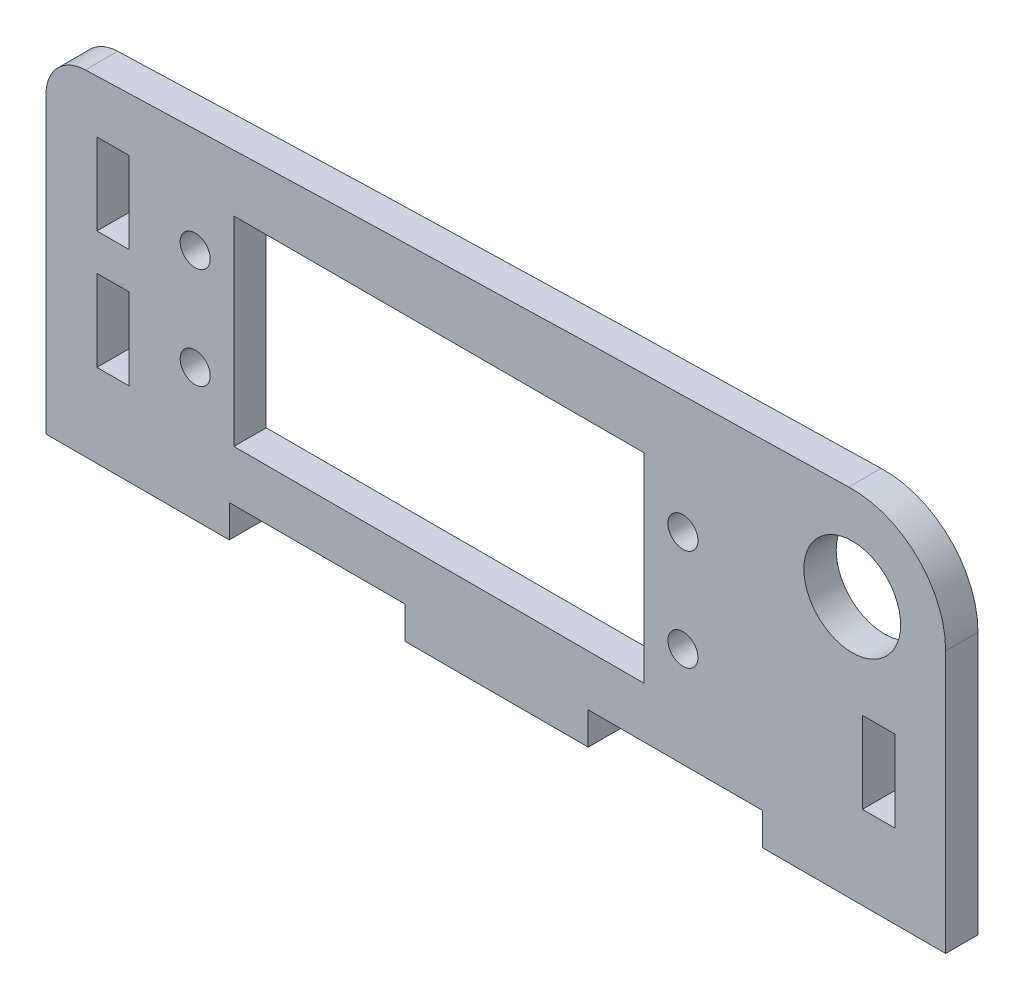
ISO-10303-21;
HEADER;
FILE_DESCRIPTION(('STEP AP214'),'2;1');
FILE_NAME('part.step','',(''),(''),'','','');
FILE_SCHEMA(('AUTOMOTIVE_DESIGN { 1 0 10303 214 1 1 1 1 }'));
ENDSEC;
DATA;
#1=APPLICATION_CONTEXT('core data for automotive mechanical design processes');
#2=APPLICATION_PROTOCOL_DEFINITION('international standard','automotive_design',2000,#1);
#3=PRODUCT_CONTEXT('',#1,'mechanical');
#4=PRODUCT('Part','Part','',(#3));
#5=PRODUCT_RELATED_PRODUCT_CATEGORY('part','',(#4));
#6=PRODUCT_DEFINITION_FORMATION('','',#4);
#7=PRODUCT_DEFINITION_CONTEXT('part definition',#1,'design');
#8=PRODUCT_DEFINITION('design','',#6,#7);
#9=PRODUCT_DEFINITION_SHAPE('','',#8);
#10=(LENGTH_UNIT() NAMED_UNIT(*) SI_UNIT(.MILLI.,.METRE.));
#11=(NAMED_UNIT(*) PLANE_ANGLE_UNIT() SI_UNIT($,.RADIAN.));
#12=(NAMED_UNIT(*) SI_UNIT($,.STERADIAN.) SOLID_ANGLE_UNIT());
#13=UNCERTAINTY_MEASURE_WITH_UNIT(LENGTH_MEASURE(1.E-05),#10,'distance_accuracy_value','');
#14=(GEOMETRIC_REPRESENTATION_CONTEXT(3) GLOBAL_UNCERTAINTY_ASSIGNED_CONTEXT((#13)) GLOBAL_UNIT_ASSIGNED_CONTEXT((#10,
#11,#12)) REPRESENTATION_CONTEXT('',''));
#15=CARTESIAN_POINT('',(0.,0.,0.));
#16=DIRECTION('',(0.,0.,1.));
#17=DIRECTION('',(1.,0.,0.));
#18=AXIS2_PLACEMENT_3D('',#15,#16,#17);
#19=CARTESIAN_POINT('',(26.416,-14.8,3.175));
#20=DIRECTION('',(0.,-1.,0.));
#21=DIRECTION('',(1.,0.,0.));
#22=AXIS2_PLACEMENT_3D('',#19,#20,#21);
#23=PLANE('',#22);
#24=DIRECTION('',(0.,0.,-1.));
#25=VECTOR('',#24,1.);
#26=CARTESIAN_POINT('',(-20.6,-14.8,21.4528725512572));
#27=LINE('',#26,#25);
#28=CARTESIAN_POINT('',(-20.6,-14.8,3.175));
#29=VERTEX_POINT('',#28);
#30=CARTESIAN_POINT('',(-20.6,-14.8,0.));
#31=VERTEX_POINT('',#30);
#32=EDGE_CURVE('E53',#29,#31,#27,.T.);
#33=ORIENTED_EDGE('',*,*,#32,.T.);
#34=DIRECTION('',(-1.,0.,0.));
#35=VECTOR('',#34,1.);
#36=CARTESIAN_POINT('',(26.416,-14.8,0.));
#37=LINE('',#36,#35);
#38=CARTESIAN_POINT('',(-3.35000000000001,-14.8,0.));
#39=VERTEX_POINT('',#38);
#40=EDGE_CURVE('E476',#39,#31,#37,.T.);
#41=ORIENTED_EDGE('',*,*,#40,.F.);
#42=DIRECTION('',(0.,0.,-1.));
#43=VECTOR('',#42,1.);
#44=CARTESIAN_POINT('',(-3.35000000000001,-14.8,21.4528725512572));
#45=LINE('',#44,#43);
#46=CARTESIAN_POINT('',(-3.35000000000001,-14.8,3.175));
#47=VERTEX_POINT('',#46);
#48=EDGE_CURVE('E279',#47,#39,#45,.T.);
#49=ORIENTED_EDGE('',*,*,#48,.F.);
#50=DIRECTION('',(-1.,0.,0.));
#51=VECTOR('',#50,1.);
#52=CARTESIAN_POINT('',(26.416,-14.8,3.175));
#53=LINE('',#52,#51);
#54=EDGE_CURVE('E58',#47,#29,#53,.T.);
#55=ORIENTED_EDGE('',*,*,#54,.T.);
#56=EDGE_LOOP('',(#33,#41,#49,#55));
#57=FACE_BOUND('',#56,.T.);
#58=ADVANCED_FACE('F38',(#57),#23,.T.);
#59=CARTESIAN_POINT('',(40.576,7.77,15.1599874843489));
#60=DIRECTION('',(0.,0.,-1.));
#61=DIRECTION('',(-1.,0.,0.));
#62=AXIS2_PLACEMENT_3D('',#59,#60,#61);
#63=CYLINDRICAL_SURFACE('',#62,9.17500000000001);
#64=CARTESIAN_POINT('',(40.576,7.77,0.));
#65=DIRECTION('',(0.,0.,-1.));
#66=DIRECTION('',(-1.,0.,0.));
#67=AXIS2_PLACEMENT_3D('',#64,#65,#66);
#68=CIRCLE('',#67,9.17500000000001);
#69=CARTESIAN_POINT('',(40.2242265775887,16.9382539482327,0.));
#70=VERTEX_POINT('',#69);
#71=CARTESIAN_POINT('',(49.751,7.77,0.));
#72=VERTEX_POINT('',#71);
#73=EDGE_CURVE('E409',#70,#72,#68,.T.);
#74=ORIENTED_EDGE('',*,*,#73,.F.);
#75=DIRECTION('',(0.,0.,-1.));
#76=VECTOR('',#75,1.);
#77=CARTESIAN_POINT('',(40.2242265775887,16.9382539482327,82.0282233044545));
#78=LINE('',#77,#76);
#79=CARTESIAN_POINT('',(40.2242265775887,16.9382539482327,3.175));
#80=VERTEX_POINT('',#79);
#81=EDGE_CURVE('E331',#80,#70,#78,.T.);
#82=ORIENTED_EDGE('',*,*,#81,.F.);
#83=CARTESIAN_POINT('',(40.576,7.77,3.175));
#84=DIRECTION('',(0.,0.,1.));
#85=DIRECTION('',(1.,0.,0.));
#86=AXIS2_PLACEMENT_3D('',#83,#84,#85);
#87=CIRCLE('',#86,9.17500000000001);
#88=CARTESIAN_POINT('',(49.751,7.77,3.175));
#89=VERTEX_POINT('',#88);
#90=EDGE_CURVE('E411',#80,#89,#87,.F.);
#91=ORIENTED_EDGE('',*,*,#90,.T.);
#92=DIRECTION('',(0.,0.,-1.));
#93=VECTOR('',#92,1.);
#94=CARTESIAN_POINT('',(49.751,7.77,10.));
#95=LINE('',#94,#93);
#96=EDGE_CURVE('E403',#89,#72,#95,.T.);
#97=ORIENTED_EDGE('',*,*,#96,.T.);
#98=EDGE_LOOP('',(#74,#82,#91,#97));
#99=FACE_BOUND('',#98,.T.);
#100=ADVANCED_FACE('F576',(#99),#63,.T.);
#101=CARTESIAN_POINT('',(-30.425,0.,33.0452541167631));
#102=DIRECTION('',(1.,0.,0.));
#103=DIRECTION('',(0.,1.,0.));
#104=AXIS2_PLACEMENT_3D('',#101,#102,#103);
#105=PLANE('',#104);
#106=DIRECTION('',(0.,0.,-1.));
#107=VECTOR('',#106,1.);
#108=CARTESIAN_POINT('',(-30.425,-9.79999999999999,33.8831524191867));
#109=LINE('',#108,#107);
#110=CARTESIAN_POINT('',(-30.425,-9.79999999999999,3.175));
#111=VERTEX_POINT('',#110);
#112=CARTESIAN_POINT('',(-30.425,-9.79999999999999,0.));
#113=VERTEX_POINT('',#112);
#114=EDGE_CURVE('E348',#111,#113,#109,.T.);
#115=ORIENTED_EDGE('',*,*,#114,.F.);
#116=DIRECTION('',(0.,-1.,0.));
#117=VECTOR('',#116,1.);
#118=CARTESIAN_POINT('',(-30.425,0.,3.175));
#119=LINE('',#118,#117);
#120=CARTESIAN_POINT('',(-30.425,-1.79999999999999,3.175));
#121=VERTEX_POINT('',#120);
#122=EDGE_CURVE('E397',#121,#111,#119,.T.);
#123=ORIENTED_EDGE('',*,*,#122,.F.);
#124=DIRECTION('',(0.,0.,-1.));
#125=VECTOR('',#124,1.);
#126=CARTESIAN_POINT('',(-30.425,-1.79999999999999,33.8831524191867));
#127=LINE('',#126,#125);
#128=CARTESIAN_POINT('',(-30.425,-1.79999999999999,0.));
#129=VERTEX_POINT('',#128);
#130=EDGE_CURVE('E386',#121,#129,#127,.T.);
#131=ORIENTED_EDGE('',*,*,#130,.T.);
#132=DIRECTION('',(0.,-1.,0.));
#133=VECTOR('',#132,1.);
#134=CARTESIAN_POINT('',(-30.425,0.,0.));
#135=LINE('',#134,#133);
#136=EDGE_CURVE('E375',#129,#113,#135,.T.);
#137=ORIENTED_EDGE('',*,*,#136,.T.);
#138=EDGE_LOOP('',(#115,#123,#131,#137));
#139=FACE_BOUND('',#138,.T.);
#140=ADVANCED_FACE('F597',(#139),#105,.F.);
#141=DIRECTION('',(0.,0.,-1.));
#142=VECTOR('',#141,1.);
#143=CARTESIAN_POINT('',(-30.425,1.8,33.8831524191867));
#144=LINE('',#143,#142);
#145=CARTESIAN_POINT('',(-30.425,1.8,3.175));
#146=VERTEX_POINT('',#145);
#147=CARTESIAN_POINT('',(-30.425,1.8,0.));
#148=VERTEX_POINT('',#147);
#149=EDGE_CURVE('E359',#146,#148,#144,.T.);
#150=ORIENTED_EDGE('',*,*,#149,.F.);
#151=CARTESIAN_POINT('',(-30.425,9.8,3.175));
#152=VERTEX_POINT('',#151);
#153=EDGE_CURVE('E400',#152,#146,#119,.T.);
#154=ORIENTED_EDGE('',*,*,#153,.F.);
#155=DIRECTION('',(0.,0.,-1.));
#156=VECTOR('',#155,1.);
#157=CARTESIAN_POINT('',(-30.425,9.8,33.8831524191867));
#158=LINE('',#157,#156);
#159=CARTESIAN_POINT('',(-30.425,9.8,0.));
#160=VERTEX_POINT('',#159);
#161=EDGE_CURVE('E365',#152,#160,#158,.T.);
#162=ORIENTED_EDGE('',*,*,#161,.T.);
#163=EDGE_CURVE('E396',#160,#148,#135,.T.);
#164=ORIENTED_EDGE('',*,*,#163,.T.);
#165=EDGE_LOOP('',(#150,#154,#162,#164));
#166=FACE_BOUND('',#165,.T.);
#167=ADVANCED_FACE('F516',(#166),#105,.F.);
#168=CARTESIAN_POINT('',(0.,0.,0.));
#169=DIRECTION('',(0.,0.,1.));
#170=DIRECTION('',(1.,0.,0.));
#171=AXIS2_PLACEMENT_3D('',#168,#169,#170);
#172=PLANE('',#171);
#173=DIRECTION('',(-1.,0.,0.));
#174=VECTOR('',#173,1.);
#175=CARTESIAN_POINT('',(44.751,-9.79999999999999,0.));
#176=LINE('',#175,#174);
#177=CARTESIAN_POINT('',(44.751,-9.79999999999999,0.));
#178=VERTEX_POINT('',#177);
#179=CARTESIAN_POINT('',(41.576,-9.79999999999999,0.));
#180=VERTEX_POINT('',#179);
#181=EDGE_CURVE('E319',#178,#180,#176,.T.);
#182=ORIENTED_EDGE('',*,*,#181,.F.);
#183=DIRECTION('',(0.,-1.,0.));
#184=VECTOR('',#183,1.);
#185=CARTESIAN_POINT('',(44.751,-9.79999999999999,0.));
#186=LINE('',#185,#184);
#187=CARTESIAN_POINT('',(44.751,-1.79999999999999,0.));
#188=VERTEX_POINT('',#187);
#189=EDGE_CURVE('E311',#188,#178,#186,.T.);
#190=ORIENTED_EDGE('',*,*,#189,.F.);
#191=DIRECTION('',(1.,0.,0.));
#192=VECTOR('',#191,1.);
#193=CARTESIAN_POINT('',(44.751,-1.79999999999999,0.));
#194=LINE('',#193,#192);
#195=CARTESIAN_POINT('',(41.576,-1.79999999999999,0.));
#196=VERTEX_POINT('',#195);
#197=EDGE_CURVE('E325',#196,#188,#194,.T.);
#198=ORIENTED_EDGE('',*,*,#197,.F.);
#199=DIRECTION('',(0.,1.,0.));
#200=VECTOR('',#199,1.);
#201=CARTESIAN_POINT('',(41.576,-9.79999999999999,0.));
#202=LINE('',#201,#200);
#203=EDGE_CURVE('E322',#180,#196,#202,.T.);
#204=ORIENTED_EDGE('',*,*,#203,.F.);
#205=EDGE_LOOP('',(#182,#190,#198,#204));
#206=FACE_BOUND('',#205,.T.);
#207=DIRECTION('',(-1.,0.,0.));
#208=VECTOR('',#207,1.);
#209=CARTESIAN_POINT('',(0.,-9.79999999999999,0.));
#210=LINE('',#209,#208);
#211=CARTESIAN_POINT('',(-33.6,-9.79999999999999,0.));
#212=VERTEX_POINT('',#211);
#213=EDGE_CURVE('E344',#113,#212,#210,.T.);
#214=ORIENTED_EDGE('',*,*,#213,.F.);
#215=ORIENTED_EDGE('',*,*,#136,.F.);
#216=DIRECTION('',(-1.,0.,0.));
#217=VECTOR('',#216,1.);
#218=CARTESIAN_POINT('',(0.,-1.79999999999999,0.));
#219=LINE('',#218,#217);
#220=CARTESIAN_POINT('',(-33.6,-1.79999999999999,0.));
#221=VERTEX_POINT('',#220);
#222=EDGE_CURVE('E351',#129,#221,#219,.T.);
#223=ORIENTED_EDGE('',*,*,#222,.T.);
#224=DIRECTION('',(0.,-1.,0.));
#225=VECTOR('',#224,1.);
#226=CARTESIAN_POINT('',(-33.6,0.,0.));
#227=LINE('',#226,#225);
#228=EDGE_CURVE('E246',#221,#212,#227,.T.);
#229=ORIENTED_EDGE('',*,*,#228,.T.);
#230=EDGE_LOOP('',(#214,#215,#223,#229));
#231=FACE_BOUND('',#230,.T.);
#232=DIRECTION('',(-1.,0.,0.));
#233=VECTOR('',#232,1.);
#234=CARTESIAN_POINT('',(0.,1.8,0.));
#235=LINE('',#234,#233);
#236=CARTESIAN_POINT('',(-33.6,1.8,0.));
#237=VERTEX_POINT('',#236);
#238=EDGE_CURVE('E355',#148,#237,#235,.T.);
#239=ORIENTED_EDGE('',*,*,#238,.F.);
#240=ORIENTED_EDGE('',*,*,#163,.F.);
#241=DIRECTION('',(-1.,0.,0.));
#242=VECTOR('',#241,1.);
#243=CARTESIAN_POINT('',(0.,9.8,0.));
#244=LINE('',#243,#242);
#245=CARTESIAN_POINT('',(-33.6,9.8,0.));
#246=VERTEX_POINT('',#245);
#247=EDGE_CURVE('E362',#160,#246,#244,.T.);
#248=ORIENTED_EDGE('',*,*,#247,.T.);
#249=DIRECTION('',(0.,-1.,0.));
#250=VECTOR('',#249,1.);
#251=CARTESIAN_POINT('',(-33.6,0.,0.));
#252=LINE('',#251,#250);
#253=EDGE_CURVE('E354',#246,#237,#252,.T.);
#254=ORIENTED_EDGE('',*,*,#253,.T.);
#255=EDGE_LOOP('',(#239,#240,#248,#254));
#256=FACE_BOUND('',#255,.T.);
#257=CARTESIAN_POINT('',(23.95,4.974,0.));
#258=DIRECTION('',(0.,0.,1.));
#259=DIRECTION('',(1.,0.,0.));
#260=AXIS2_PLACEMENT_3D('',#257,#258,#259);
#261=CIRCLE('',#260,1.475);
#262=CARTESIAN_POINT('',(25.425,4.974,0.));
#263=VERTEX_POINT('',#262);
#264=EDGE_CURVE('E455',#263,#263,#261,.T.);
#265=ORIENTED_EDGE('',*,*,#264,.T.);
#266=EDGE_LOOP('',(#265));
#267=FACE_BOUND('',#266,.T.);
#268=CARTESIAN_POINT('',(23.95,-4.974,0.));
#269=DIRECTION('',(0.,0.,1.));
#270=DIRECTION('',(1.,0.,0.));
#271=AXIS2_PLACEMENT_3D('',#268,#269,#270);
#272=CIRCLE('',#271,1.475);
#273=CARTESIAN_POINT('',(25.425,-4.974,0.));
#274=VERTEX_POINT('',#273);
#275=EDGE_CURVE('E452',#274,#274,#272,.T.);
#276=ORIENTED_EDGE('',*,*,#275,.T.);
#277=EDGE_LOOP('',(#276));
#278=FACE_BOUND('',#277,.T.);
#279=DIRECTION('',(0.,1.,0.));
#280=VECTOR('',#279,1.);
#281=CARTESIAN_POINT('',(-20.15,0.,0.));
#282=LINE('',#281,#280);
#283=CARTESIAN_POINT('',(-20.15,-9.8,0.));
#284=VERTEX_POINT('',#283);
#285=CARTESIAN_POINT('',(-20.15,9.8,0.));
#286=VERTEX_POINT('',#285);
#287=EDGE_CURVE('E421',#284,#286,#282,.T.);
#288=ORIENTED_EDGE('',*,*,#287,.F.);
#289=DIRECTION('',(-1.,0.,0.));
#290=VECTOR('',#289,1.);
#291=CARTESIAN_POINT('',(26.416,-9.8,0.));
#292=LINE('',#291,#290);
#293=CARTESIAN_POINT('',(20.15,-9.8,0.));
#294=VERTEX_POINT('',#293);
#295=EDGE_CURVE('E475',#294,#284,#292,.T.);
#296=ORIENTED_EDGE('',*,*,#295,.F.);
#297=DIRECTION('',(0.,1.,0.));
#298=VECTOR('',#297,1.);
#299=CARTESIAN_POINT('',(20.15,0.,0.));
#300=LINE('',#299,#298);
#301=CARTESIAN_POINT('',(20.15,9.8,0.));
#302=VERTEX_POINT('',#301);
#303=EDGE_CURVE('E445',#294,#302,#300,.T.);
#304=ORIENTED_EDGE('',*,*,#303,.T.);
#305=DIRECTION('',(1.,0.,0.));
#306=VECTOR('',#305,1.);
#307=CARTESIAN_POINT('',(-26.416,9.8,0.));
#308=LINE('',#307,#306);
#309=EDGE_CURVE('E465',#286,#302,#308,.T.);
#310=ORIENTED_EDGE('',*,*,#309,.F.);
#311=EDGE_LOOP('',(#288,#296,#304,#310));
#312=FACE_BOUND('',#311,.T.);
#313=CARTESIAN_POINT('',(-23.95,-4.974,0.));
#314=DIRECTION('',(0.,0.,1.));
#315=DIRECTION('',(1.,0.,0.));
#316=AXIS2_PLACEMENT_3D('',#313,#314,#315);
#317=CIRCLE('',#316,1.475);
#318=CARTESIAN_POINT('',(-22.475,-4.974,0.));
#319=VERTEX_POINT('',#318);
#320=EDGE_CURVE('E431',#319,#319,#317,.T.);
#321=ORIENTED_EDGE('',*,*,#320,.T.);
#322=EDGE_LOOP('',(#321));
#323=FACE_BOUND('',#322,.T.);
#324=CARTESIAN_POINT('',(-23.95,4.974,0.));
#325=DIRECTION('',(0.,0.,1.));
#326=DIRECTION('',(1.,0.,0.));
#327=AXIS2_PLACEMENT_3D('',#324,#325,#326);
#328=CIRCLE('',#327,1.475);
#329=CARTESIAN_POINT('',(-22.475,4.974,0.));
#330=VERTEX_POINT('',#329);
#331=EDGE_CURVE('E428',#330,#330,#328,.T.);
#332=ORIENTED_EDGE('',*,*,#331,.T.);
#333=EDGE_LOOP('',(#332));
#334=FACE_BOUND('',#333,.T.);
#335=CARTESIAN_POINT('',(40.576,7.77,0.));
#336=DIRECTION('',(0.,0.,-1.));
#337=DIRECTION('',(-1.,0.,0.));
#338=AXIS2_PLACEMENT_3D('',#335,#336,#337);
#339=CIRCLE('',#338,4.75);
#340=CARTESIAN_POINT('',(35.826,7.77,0.));
#341=VERTEX_POINT('',#340);
#342=EDGE_CURVE('E413',#341,#341,#339,.T.);
#343=ORIENTED_EDGE('',*,*,#342,.F.);
#344=EDGE_LOOP('',(#343));
#345=FACE_BOUND('',#344,.T.);
#346=DIRECTION('',(0.,-1.,0.));
#347=VECTOR('',#346,1.);
#348=CARTESIAN_POINT('',(-38.6,0.,0.));
#349=LINE('',#348,#347);
#350=CARTESIAN_POINT('',(-38.6,10.9362242655928,0.));
#351=VERTEX_POINT('',#350);
#352=CARTESIAN_POINT('',(-38.6,-17.975,0.));
#353=VERTEX_POINT('',#352);
#354=EDGE_CURVE('E252',#351,#353,#349,.T.);
#355=ORIENTED_EDGE('',*,*,#354,.F.);
#356=CARTESIAN_POINT('',(-34.6,10.9362242655928,0.));
#357=DIRECTION('',(0.,0.,1.));
#358=DIRECTION('',(1.,0.,0.));
#359=AXIS2_PLACEMENT_3D('',#356,#357,#358);
#360=CIRCLE('',#359,4.);
#361=CARTESIAN_POINT('',(-34.7369921599961,14.9338777208214,0.));
#362=VERTEX_POINT('',#361);
#363=EDGE_CURVE('E482',#351,#362,#360,.F.);
#364=ORIENTED_EDGE('',*,*,#363,.T.);
#365=CARTESIAN_POINT('',(135.970658529118,-4966.59228867196,0.));
#366=DIRECTION('',(0.,0.,-1.));
#367=DIRECTION('',(-1.,0.,0.));
#368=AXIS2_PLACEMENT_3D('',#365,#366,#367);
#369=CIRCLE('',#368,4984.45022529665);
#370=EDGE_CURVE('E338',#70,#362,#369,.F.);
#371=ORIENTED_EDGE('',*,*,#370,.F.);
#372=ORIENTED_EDGE('',*,*,#73,.T.);
#373=DIRECTION('',(0.,-1.,0.));
#374=VECTOR('',#373,1.);
#375=CARTESIAN_POINT('',(49.751,0.,0.));
#376=LINE('',#375,#374);
#377=CARTESIAN_POINT('',(49.751,-17.975,0.));
#378=VERTEX_POINT('',#377);
#379=EDGE_CURVE('E401',#72,#378,#376,.T.);
#380=ORIENTED_EDGE('',*,*,#379,.T.);
#381=DIRECTION('',(-1.,0.,0.));
#382=VECTOR('',#381,1.);
#383=CARTESIAN_POINT('',(49.751,-17.975,0.));
#384=LINE('',#383,#382);
#385=CARTESIAN_POINT('',(31.751,-17.975,0.));
#386=VERTEX_POINT('',#385);
#387=EDGE_CURVE('E301',#378,#386,#384,.T.);
#388=ORIENTED_EDGE('',*,*,#387,.T.);
#389=DIRECTION('',(0.,-1.,0.));
#390=VECTOR('',#389,1.);
#391=CARTESIAN_POINT('',(31.751,-14.8,0.));
#392=LINE('',#391,#390);
#393=CARTESIAN_POINT('',(31.751,-14.8,0.));
#394=VERTEX_POINT('',#393);
#395=EDGE_CURVE('E298',#394,#386,#392,.T.);
#396=ORIENTED_EDGE('',*,*,#395,.F.);
#397=CARTESIAN_POINT('',(14.65,-14.8,0.));
#398=VERTEX_POINT('',#397);
#399=EDGE_CURVE('E472',#394,#398,#37,.T.);
#400=ORIENTED_EDGE('',*,*,#399,.T.);
#401=DIRECTION('',(0.,-1.,0.));
#402=VECTOR('',#401,1.);
#403=CARTESIAN_POINT('',(14.65,-14.8,0.));
#404=LINE('',#403,#402);
#405=CARTESIAN_POINT('',(14.65,-17.975,0.));
#406=VERTEX_POINT('',#405);
#407=EDGE_CURVE('E264',#398,#406,#404,.T.);
#408=ORIENTED_EDGE('',*,*,#407,.T.);
#409=DIRECTION('',(-1.,0.,0.));
#410=VECTOR('',#409,1.);
#411=CARTESIAN_POINT('',(14.65,-17.975,0.));
#412=LINE('',#411,#410);
#413=CARTESIAN_POINT('',(-3.35000000000001,-17.975,0.));
#414=VERTEX_POINT('',#413);
#415=EDGE_CURVE('E291',#406,#414,#412,.T.);
#416=ORIENTED_EDGE('',*,*,#415,.T.);
#417=DIRECTION('',(0.,-1.,0.));
#418=VECTOR('',#417,1.);
#419=CARTESIAN_POINT('',(-3.35000000000001,-14.8,0.));
#420=LINE('',#419,#418);
#421=EDGE_CURVE('E283',#39,#414,#420,.T.);
#422=ORIENTED_EDGE('',*,*,#421,.F.);
#423=ORIENTED_EDGE('',*,*,#40,.T.);
#424=DIRECTION('',(0.,-1.,0.));
#425=VECTOR('',#424,1.);
#426=CARTESIAN_POINT('',(-20.6,-14.8,0.));
#427=LINE('',#426,#425);
#428=CARTESIAN_POINT('',(-20.6,-17.975,0.));
#429=VERTEX_POINT('',#428);
#430=EDGE_CURVE('E272',#31,#429,#427,.T.);
#431=ORIENTED_EDGE('',*,*,#430,.T.);
#432=DIRECTION('',(-1.,0.,0.));
#433=VECTOR('',#432,1.);
#434=CARTESIAN_POINT('',(-20.6,-17.975,0.));
#435=LINE('',#434,#433);
#436=EDGE_CURVE('E270',#429,#353,#435,.T.);
#437=ORIENTED_EDGE('',*,*,#436,.T.);
#438=EDGE_LOOP('',(#355,#364,#371,#372,#380,#388,#396,#400,#408,#416,#422,#423,#431,#437));
#439=FACE_BOUND('',#438,.T.);
#440=ADVANCED_FACE('F513',(#206,#231,#256,#267,#278,#312,#323,#334,#345,#439),#172,.F.);
#441=CARTESIAN_POINT('',(0.,0.,3.175));
#442=DIRECTION('',(0.,0.,1.));
#443=DIRECTION('',(1.,0.,0.));
#444=AXIS2_PLACEMENT_3D('',#441,#442,#443);
#445=PLANE('',#444);
#446=DIRECTION('',(0.,1.,0.));
#447=VECTOR('',#446,1.);
#448=CARTESIAN_POINT('',(44.751,0.,3.175));
#449=LINE('',#448,#447);
#450=CARTESIAN_POINT('',(44.751,-9.79999999999999,3.175));
#451=VERTEX_POINT('',#450);
#452=CARTESIAN_POINT('',(44.751,-1.79999999999999,3.175));
#453=VERTEX_POINT('',#452);
#454=EDGE_CURVE('E11',#451,#453,#449,.T.);
#455=ORIENTED_EDGE('',*,*,#454,.F.);
#456=DIRECTION('',(1.,0.,0.));
#457=VECTOR('',#456,1.);
#458=CARTESIAN_POINT('',(0.,-9.79999999999999,3.175));
#459=LINE('',#458,#457);
#460=CARTESIAN_POINT('',(41.576,-9.79999999999999,3.175));
#461=VERTEX_POINT('',#460);
#462=EDGE_CURVE('E487',#461,#451,#459,.T.);
#463=ORIENTED_EDGE('',*,*,#462,.F.);
#464=DIRECTION('',(0.,-1.,0.));
#465=VECTOR('',#464,1.);
#466=CARTESIAN_POINT('',(41.576,0.,3.175));
#467=LINE('',#466,#465);
#468=CARTESIAN_POINT('',(41.576,-1.79999999999999,3.175));
#469=VERTEX_POINT('',#468);
#470=EDGE_CURVE('E489',#469,#461,#467,.T.);
#471=ORIENTED_EDGE('',*,*,#470,.F.);
#472=DIRECTION('',(-1.,0.,0.));
#473=VECTOR('',#472,1.);
#474=CARTESIAN_POINT('',(0.,-1.79999999999999,3.175));
#475=LINE('',#474,#473);
#476=EDGE_CURVE('E46',#453,#469,#475,.T.);
#477=ORIENTED_EDGE('',*,*,#476,.F.);
#478=EDGE_LOOP('',(#455,#463,#471,#477));
#479=FACE_BOUND('',#478,.T.);
#480=DIRECTION('',(-1.,0.,0.));
#481=VECTOR('',#480,1.);
#482=CARTESIAN_POINT('',(0.,9.8,3.175));
#483=LINE('',#482,#481);
#484=CARTESIAN_POINT('',(-33.6,9.8,3.175));
#485=VERTEX_POINT('',#484);
#486=EDGE_CURVE('E367',#152,#485,#483,.T.);
#487=ORIENTED_EDGE('',*,*,#486,.F.);
#488=ORIENTED_EDGE('',*,*,#153,.T.);
#489=DIRECTION('',(-1.,0.,0.));
#490=VECTOR('',#489,1.);
#491=CARTESIAN_POINT('',(0.,1.8,3.175));
#492=LINE('',#491,#490);
#493=CARTESIAN_POINT('',(-33.6,1.8,3.175));
#494=VERTEX_POINT('',#493);
#495=EDGE_CURVE('E372',#146,#494,#492,.T.);
#496=ORIENTED_EDGE('',*,*,#495,.T.);
#497=DIRECTION('',(0.,-1.,0.));
#498=VECTOR('',#497,1.);
#499=CARTESIAN_POINT('',(-33.6,0.,3.175));
#500=LINE('',#499,#498);
#501=EDGE_CURVE('E358',#485,#494,#500,.T.);
#502=ORIENTED_EDGE('',*,*,#501,.F.);
#503=EDGE_LOOP('',(#487,#488,#496,#502));
#504=FACE_BOUND('',#503,.T.);
#505=CARTESIAN_POINT('',(135.970658529118,-4966.59228867196,3.175));
#506=DIRECTION('',(0.,0.,1.));
#507=DIRECTION('',(1.,0.,0.));
#508=AXIS2_PLACEMENT_3D('',#505,#506,#507);
#509=CIRCLE('',#508,4984.45022529665);
#510=CARTESIAN_POINT('',(-34.7369921599961,14.9338777208214,3.175));
#511=VERTEX_POINT('',#510);
#512=EDGE_CURVE('E341',#80,#511,#509,.T.);
#513=ORIENTED_EDGE('',*,*,#512,.T.);
#514=CARTESIAN_POINT('',(-34.6,10.9362242655928,3.175));
#515=DIRECTION('',(0.,0.,1.));
#516=DIRECTION('',(1.,0.,0.));
#517=AXIS2_PLACEMENT_3D('',#514,#515,#516);
#518=CIRCLE('',#517,4.);
#519=CARTESIAN_POINT('',(-38.6,10.9362242655928,3.175));
#520=VERTEX_POINT('',#519);
#521=EDGE_CURVE('E241',#511,#520,#518,.T.);
#522=ORIENTED_EDGE('',*,*,#521,.T.);
#523=DIRECTION('',(0.,-1.,0.));
#524=VECTOR('',#523,1.);
#525=CARTESIAN_POINT('',(-38.6,0.,3.175));
#526=LINE('',#525,#524);
#527=CARTESIAN_POINT('',(-38.6,-17.975,3.175));
#528=VERTEX_POINT('',#527);
#529=EDGE_CURVE('E232',#520,#528,#526,.T.);
#530=ORIENTED_EDGE('',*,*,#529,.T.);
#531=DIRECTION('',(-1.,0.,0.));
#532=VECTOR('',#531,1.);
#533=CARTESIAN_POINT('',(-20.6,-17.975,3.175));
#534=LINE('',#533,#532);
#535=CARTESIAN_POINT('',(-20.6,-17.975,3.175));
#536=VERTEX_POINT('',#535);
#537=EDGE_CURVE('E239',#536,#528,#534,.T.);
#538=ORIENTED_EDGE('',*,*,#537,.F.);
#539=DIRECTION('',(0.,-1.,0.));
#540=VECTOR('',#539,1.);
#541=CARTESIAN_POINT('',(-20.6,-14.8,3.175));
#542=LINE('',#541,#540);
#543=EDGE_CURVE('E256',#29,#536,#542,.T.);
#544=ORIENTED_EDGE('',*,*,#543,.F.);
#545=ORIENTED_EDGE('',*,*,#54,.F.);
#546=DIRECTION('',(0.,-1.,0.));
#547=VECTOR('',#546,1.);
#548=CARTESIAN_POINT('',(-3.35000000000001,-14.8,3.175));
#549=LINE('',#548,#547);
#550=CARTESIAN_POINT('',(-3.35000000000001,-17.975,3.175));
#551=VERTEX_POINT('',#550);
#552=EDGE_CURVE('E261',#47,#551,#549,.T.);
#553=ORIENTED_EDGE('',*,*,#552,.T.);
#554=DIRECTION('',(-1.,0.,0.));
#555=VECTOR('',#554,1.);
#556=CARTESIAN_POINT('',(14.65,-17.975,3.175));
#557=LINE('',#556,#555);
#558=CARTESIAN_POINT('',(14.65,-17.975,3.175));
#559=VERTEX_POINT('',#558);
#560=EDGE_CURVE('E277',#559,#551,#557,.T.);
#561=ORIENTED_EDGE('',*,*,#560,.F.);
#562=DIRECTION('',(0.,-1.,0.));
#563=VECTOR('',#562,1.);
#564=CARTESIAN_POINT('',(14.65,-14.8,3.175));
#565=LINE('',#564,#563);
#566=CARTESIAN_POINT('',(14.65,-14.8,3.175));
#567=VERTEX_POINT('',#566);
#568=EDGE_CURVE('E278',#567,#559,#565,.T.);
#569=ORIENTED_EDGE('',*,*,#568,.F.);
#570=CARTESIAN_POINT('',(31.751,-14.8,3.175));
#571=VERTEX_POINT('',#570);
#572=EDGE_CURVE('E468',#571,#567,#53,.T.);
#573=ORIENTED_EDGE('',*,*,#572,.F.);
#574=DIRECTION('',(0.,-1.,0.));
#575=VECTOR('',#574,1.);
#576=CARTESIAN_POINT('',(31.751,-14.8,3.175));
#577=LINE('',#576,#575);
#578=CARTESIAN_POINT('',(31.751,-17.975,3.175));
#579=VERTEX_POINT('',#578);
#580=EDGE_CURVE('E305',#571,#579,#577,.T.);
#581=ORIENTED_EDGE('',*,*,#580,.T.);
#582=DIRECTION('',(-1.,0.,0.));
#583=VECTOR('',#582,1.);
#584=CARTESIAN_POINT('',(49.751,-17.975,3.175));
#585=LINE('',#584,#583);
#586=CARTESIAN_POINT('',(49.751,-17.975,3.175));
#587=VERTEX_POINT('',#586);
#588=EDGE_CURVE('E289',#587,#579,#585,.T.);
#589=ORIENTED_EDGE('',*,*,#588,.F.);
#590=DIRECTION('',(0.,1.,0.));
#591=VECTOR('',#590,1.);
#592=CARTESIAN_POINT('',(49.751,0.,3.175));
#593=LINE('',#592,#591);
#594=EDGE_CURVE('E406',#587,#89,#593,.T.);
#595=ORIENTED_EDGE('',*,*,#594,.T.);
#596=ORIENTED_EDGE('',*,*,#90,.F.);
#597=EDGE_LOOP('',(#513,#522,#530,#538,#544,#545,#553,#561,#569,#573,#581,#589,#595,#596));
#598=FACE_BOUND('',#597,.T.);
#599=CARTESIAN_POINT('',(40.576,7.77,3.175));
#600=DIRECTION('',(0.,0.,1.));
#601=DIRECTION('',(1.,0.,0.));
#602=AXIS2_PLACEMENT_3D('',#599,#600,#601);
#603=CIRCLE('',#602,4.75);
#604=CARTESIAN_POINT('',(45.326,7.77,3.175));
#605=VERTEX_POINT('',#604);
#606=EDGE_CURVE('E416',#605,#605,#603,.T.);
#607=ORIENTED_EDGE('',*,*,#606,.F.);
#608=EDGE_LOOP('',(#607));
#609=FACE_BOUND('',#608,.T.);
#610=CARTESIAN_POINT('',(-23.95,4.974,3.175));
#611=DIRECTION('',(0.,0.,1.));
#612=DIRECTION('',(1.,0.,0.));
#613=AXIS2_PLACEMENT_3D('',#610,#611,#612);
#614=CIRCLE('',#613,1.475);
#615=CARTESIAN_POINT('',(-22.475,4.974,3.175));
#616=VERTEX_POINT('',#615);
#617=EDGE_CURVE('E417',#616,#616,#614,.T.);
#618=ORIENTED_EDGE('',*,*,#617,.F.);
#619=EDGE_LOOP('',(#618));
#620=FACE_BOUND('',#619,.T.);
#621=CARTESIAN_POINT('',(-23.95,-4.974,3.175));
#622=DIRECTION('',(0.,0.,1.));
#623=DIRECTION('',(1.,0.,0.));
#624=AXIS2_PLACEMENT_3D('',#621,#622,#623);
#625=CIRCLE('',#624,1.475);
#626=CARTESIAN_POINT('',(-22.475,-4.974,3.175));
#627=VERTEX_POINT('',#626);
#628=EDGE_CURVE('E420',#627,#627,#625,.T.);
#629=ORIENTED_EDGE('',*,*,#628,.F.);
#630=EDGE_LOOP('',(#629));
#631=FACE_BOUND('',#630,.T.);
#632=DIRECTION('',(0.,1.,0.));
#633=VECTOR('',#632,1.);
#634=CARTESIAN_POINT('',(20.15,0.,3.175));
#635=LINE('',#634,#633);
#636=CARTESIAN_POINT('',(20.15,-9.8,3.175));
#637=VERTEX_POINT('',#636);
#638=CARTESIAN_POINT('',(20.15,9.8,3.175));
#639=VERTEX_POINT('',#638);
#640=EDGE_CURVE('E448',#637,#639,#635,.T.);
#641=ORIENTED_EDGE('',*,*,#640,.F.);
#642=DIRECTION('',(-1.,0.,0.));
#643=VECTOR('',#642,1.);
#644=CARTESIAN_POINT('',(26.416,-9.8,3.175));
#645=LINE('',#644,#643);
#646=CARTESIAN_POINT('',(-20.15,-9.8,3.175));
#647=VERTEX_POINT('',#646);
#648=EDGE_CURVE('E467',#637,#647,#645,.T.);
#649=ORIENTED_EDGE('',*,*,#648,.T.);
#650=DIRECTION('',(0.,1.,0.));
#651=VECTOR('',#650,1.);
#652=CARTESIAN_POINT('',(-20.15,0.,3.175));
#653=LINE('',#652,#651);
#654=CARTESIAN_POINT('',(-20.15,9.8,3.175));
#655=VERTEX_POINT('',#654);
#656=EDGE_CURVE('E424',#647,#655,#653,.T.);
#657=ORIENTED_EDGE('',*,*,#656,.T.);
#658=DIRECTION('',(1.,0.,0.));
#659=VECTOR('',#658,1.);
#660=CARTESIAN_POINT('',(-26.416,9.8,3.175));
#661=LINE('',#660,#659);
#662=EDGE_CURVE('E456',#655,#639,#661,.T.);
#663=ORIENTED_EDGE('',*,*,#662,.T.);
#664=EDGE_LOOP('',(#641,#649,#657,#663));
#665=FACE_BOUND('',#664,.T.);
#666=CARTESIAN_POINT('',(23.95,-4.974,3.175));
#667=DIRECTION('',(0.,0.,1.));
#668=DIRECTION('',(1.,0.,0.));
#669=AXIS2_PLACEMENT_3D('',#666,#667,#668);
#670=CIRCLE('',#669,1.475);
#671=CARTESIAN_POINT('',(25.425,-4.974,3.175));
#672=VERTEX_POINT('',#671);
#673=EDGE_CURVE('E441',#672,#672,#670,.T.);
#674=ORIENTED_EDGE('',*,*,#673,.F.);
#675=EDGE_LOOP('',(#674));
#676=FACE_BOUND('',#675,.T.);
#677=CARTESIAN_POINT('',(23.95,4.974,3.175));
#678=DIRECTION('',(0.,0.,1.));
#679=DIRECTION('',(1.,0.,0.));
#680=AXIS2_PLACEMENT_3D('',#677,#678,#679);
#681=CIRCLE('',#680,1.475);
#682=CARTESIAN_POINT('',(25.425,4.974,3.175));
#683=VERTEX_POINT('',#682);
#684=EDGE_CURVE('E444',#683,#683,#681,.T.);
#685=ORIENTED_EDGE('',*,*,#684,.F.);
#686=EDGE_LOOP('',(#685));
#687=FACE_BOUND('',#686,.T.);
#688=DIRECTION('',(-1.,0.,0.));
#689=VECTOR('',#688,1.);
#690=CARTESIAN_POINT('',(0.,-1.79999999999999,3.175));
#691=LINE('',#690,#689);
#692=CARTESIAN_POINT('',(-33.6,-1.79999999999999,3.175));
#693=VERTEX_POINT('',#692);
#694=EDGE_CURVE('E376',#121,#693,#691,.T.);
#695=ORIENTED_EDGE('',*,*,#694,.F.);
#696=ORIENTED_EDGE('',*,*,#122,.T.);
#697=DIRECTION('',(-1.,0.,0.));
#698=VECTOR('',#697,1.);
#699=CARTESIAN_POINT('',(0.,-9.79999999999999,3.175));
#700=LINE('',#699,#698);
#701=CARTESIAN_POINT('',(-33.6,-9.79999999999999,3.175));
#702=VERTEX_POINT('',#701);
#703=EDGE_CURVE('E245',#111,#702,#700,.T.);
#704=ORIENTED_EDGE('',*,*,#703,.T.);
#705=DIRECTION('',(0.,-1.,0.));
#706=VECTOR('',#705,1.);
#707=CARTESIAN_POINT('',(-33.6,0.,3.175));
#708=LINE('',#707,#706);
#709=EDGE_CURVE('E347',#693,#702,#708,.T.);
#710=ORIENTED_EDGE('',*,*,#709,.F.);
#711=EDGE_LOOP('',(#695,#696,#704,#710));
#712=FACE_BOUND('',#711,.T.);
#713=ADVANCED_FACE('F235',(#479,#504,#598,#609,#620,#631,#665,#676,#687,#712),#445,.T.);
#714=DIRECTION('',(0.,0.,-1.));
#715=VECTOR('',#714,1.);
#716=CARTESIAN_POINT('',(14.65,-14.8,21.4528725512572));
#717=LINE('',#716,#715);
#718=EDGE_CURVE('E282',#567,#398,#717,.T.);
#719=ORIENTED_EDGE('',*,*,#718,.T.);
#720=ORIENTED_EDGE('',*,*,#399,.F.);
#721=DIRECTION('',(0.,0.,-1.));
#722=VECTOR('',#721,1.);
#723=CARTESIAN_POINT('',(31.751,-14.8,21.4528725512572));
#724=LINE('',#723,#722);
#725=EDGE_CURVE('E302',#571,#394,#724,.T.);
#726=ORIENTED_EDGE('',*,*,#725,.F.);
#727=ORIENTED_EDGE('',*,*,#572,.T.);
#728=EDGE_LOOP('',(#719,#720,#726,#727));
#729=FACE_BOUND('',#728,.T.);
#730=ADVANCED_FACE('F560',(#729),#23,.T.);
#731=CARTESIAN_POINT('',(-20.15,0.,3.175));
#732=DIRECTION('',(-1.,0.,0.));
#733=DIRECTION('',(0.,0.,1.));
#734=AXIS2_PLACEMENT_3D('',#731,#732,#733);
#735=PLANE('',#734);
#736=ORIENTED_EDGE('',*,*,#287,.T.);
#737=DIRECTION('',(0.,0.,-1.));
#738=VECTOR('',#737,1.);
#739=CARTESIAN_POINT('',(-20.15,9.8,3.175));
#740=LINE('',#739,#738);
#741=EDGE_CURVE('E427',#655,#286,#740,.T.);
#742=ORIENTED_EDGE('',*,*,#741,.F.);
#743=ORIENTED_EDGE('',*,*,#656,.F.);
#744=DIRECTION('',(0.,0.,-1.));
#745=VECTOR('',#744,1.);
#746=CARTESIAN_POINT('',(-20.15,-9.8,3.175));
#747=LINE('',#746,#745);
#748=EDGE_CURVE('E438',#647,#284,#747,.T.);
#749=ORIENTED_EDGE('',*,*,#748,.T.);
#750=EDGE_LOOP('',(#736,#742,#743,#749));
#751=FACE_BOUND('',#750,.T.);
#752=ADVANCED_FACE('F601',(#751),#735,.F.);
#753=CARTESIAN_POINT('',(-23.95,-4.974,3.175));
#754=DIRECTION('',(0.,0.,-1.));
#755=DIRECTION('',(-1.,0.,0.));
#756=AXIS2_PLACEMENT_3D('',#753,#754,#755);
#757=CYLINDRICAL_SURFACE('',#756,1.475);
#758=ORIENTED_EDGE('',*,*,#628,.T.);
#759=EDGE_LOOP('',(#758));
#760=FACE_BOUND('',#759,.T.);
#761=ORIENTED_EDGE('',*,*,#320,.F.);
#762=EDGE_LOOP('',(#761));
#763=FACE_BOUND('',#762,.T.);
#764=ADVANCED_FACE('F607',(#760,#763),#757,.F.);
#765=CARTESIAN_POINT('',(-23.95,4.974,3.175));
#766=DIRECTION('',(0.,0.,-1.));
#767=DIRECTION('',(-1.,0.,0.));
#768=AXIS2_PLACEMENT_3D('',#765,#766,#767);
#769=CYLINDRICAL_SURFACE('',#768,1.475);
#770=ORIENTED_EDGE('',*,*,#617,.T.);
#771=EDGE_LOOP('',(#770));
#772=FACE_BOUND('',#771,.T.);
#773=ORIENTED_EDGE('',*,*,#331,.F.);
#774=EDGE_LOOP('',(#773));
#775=FACE_BOUND('',#774,.T.);
#776=ADVANCED_FACE('F632',(#772,#775),#769,.F.);
#777=CARTESIAN_POINT('',(23.95,4.974,3.175));
#778=DIRECTION('',(0.,0.,-1.));
#779=DIRECTION('',(-1.,0.,0.));
#780=AXIS2_PLACEMENT_3D('',#777,#778,#779);
#781=CYLINDRICAL_SURFACE('',#780,1.475);
#782=ORIENTED_EDGE('',*,*,#684,.T.);
#783=EDGE_LOOP('',(#782));
#784=FACE_BOUND('',#783,.T.);
#785=ORIENTED_EDGE('',*,*,#264,.F.);
#786=EDGE_LOOP('',(#785));
#787=FACE_BOUND('',#786,.T.);
#788=ADVANCED_FACE('F622',(#784,#787),#781,.F.);
#789=CARTESIAN_POINT('',(23.95,-4.974,3.175));
#790=DIRECTION('',(0.,0.,-1.));
#791=DIRECTION('',(-1.,0.,0.));
#792=AXIS2_PLACEMENT_3D('',#789,#790,#791);
#793=CYLINDRICAL_SURFACE('',#792,1.475);
#794=ORIENTED_EDGE('',*,*,#673,.T.);
#795=EDGE_LOOP('',(#794));
#796=FACE_BOUND('',#795,.T.);
#797=ORIENTED_EDGE('',*,*,#275,.F.);
#798=EDGE_LOOP('',(#797));
#799=FACE_BOUND('',#798,.T.);
#800=ADVANCED_FACE('F623',(#796,#799),#793,.F.);
#801=CARTESIAN_POINT('',(20.15,0.,3.175));
#802=DIRECTION('',(-1.,0.,0.));
#803=DIRECTION('',(0.,0.,1.));
#804=AXIS2_PLACEMENT_3D('',#801,#802,#803);
#805=PLANE('',#804);
#806=ORIENTED_EDGE('',*,*,#303,.F.);
#807=DIRECTION('',(0.,0.,-1.));
#808=VECTOR('',#807,1.);
#809=CARTESIAN_POINT('',(20.15,-9.8,3.175));
#810=LINE('',#809,#808);
#811=EDGE_CURVE('E432',#637,#294,#810,.T.);
#812=ORIENTED_EDGE('',*,*,#811,.F.);
#813=ORIENTED_EDGE('',*,*,#640,.T.);
#814=DIRECTION('',(0.,0.,-1.));
#815=VECTOR('',#814,1.);
#816=CARTESIAN_POINT('',(20.15,9.8,3.175));
#817=LINE('',#816,#815);
#818=EDGE_CURVE('E451',#639,#302,#817,.T.);
#819=ORIENTED_EDGE('',*,*,#818,.T.);
#820=EDGE_LOOP('',(#806,#812,#813,#819));
#821=FACE_BOUND('',#820,.T.);
#822=ADVANCED_FACE('F610',(#821),#805,.T.);
#823=CARTESIAN_POINT('',(-26.416,9.8,3.175));
#824=DIRECTION('',(0.,1.,0.));
#825=DIRECTION('',(0.,0.,1.));
#826=AXIS2_PLACEMENT_3D('',#823,#824,#825);
#827=PLANE('',#826);
#828=ORIENTED_EDGE('',*,*,#662,.F.);
#829=ORIENTED_EDGE('',*,*,#741,.T.);
#830=ORIENTED_EDGE('',*,*,#309,.T.);
#831=ORIENTED_EDGE('',*,*,#818,.F.);
#832=EDGE_LOOP('',(#828,#829,#830,#831));
#833=FACE_BOUND('',#832,.T.);
#834=ADVANCED_FACE('F602',(#833),#827,.F.);
#835=CARTESIAN_POINT('',(26.416,-9.8,3.175));
#836=DIRECTION('',(0.,-1.,0.));
#837=DIRECTION('',(0.,0.,-1.));
#838=AXIS2_PLACEMENT_3D('',#835,#836,#837);
#839=PLANE('',#838);
#840=ORIENTED_EDGE('',*,*,#295,.T.);
#841=ORIENTED_EDGE('',*,*,#748,.F.);
#842=ORIENTED_EDGE('',*,*,#648,.F.);
#843=ORIENTED_EDGE('',*,*,#811,.T.);
#844=EDGE_LOOP('',(#840,#841,#842,#843));
#845=FACE_BOUND('',#844,.T.);
#846=ADVANCED_FACE('F613',(#845),#839,.F.);
#847=CARTESIAN_POINT('',(40.576,7.77,10.));
#848=DIRECTION('',(0.,0.,-1.));
#849=DIRECTION('',(-1.,0.,0.));
#850=AXIS2_PLACEMENT_3D('',#847,#848,#849);
#851=CYLINDRICAL_SURFACE('',#850,4.75);
#852=ORIENTED_EDGE('',*,*,#606,.T.);
#853=EDGE_LOOP('',(#852));
#854=FACE_BOUND('',#853,.T.);
#855=ORIENTED_EDGE('',*,*,#342,.T.);
#856=EDGE_LOOP('',(#855));
#857=FACE_BOUND('',#856,.T.);
#858=ADVANCED_FACE('F620',(#854,#857),#851,.F.);
#859=CARTESIAN_POINT('',(49.751,0.,10.));
#860=DIRECTION('',(1.,0.,0.));
#861=DIRECTION('',(0.,0.,-1.));
#862=AXIS2_PLACEMENT_3D('',#859,#860,#861);
#863=PLANE('',#862);
#864=ORIENTED_EDGE('',*,*,#594,.F.);
#865=DIRECTION('',(0.,0.,-1.));
#866=VECTOR('',#865,1.);
#867=CARTESIAN_POINT('',(49.751,-17.975,21.4528725512572));
#868=LINE('',#867,#866);
#869=EDGE_CURVE('E312',#587,#378,#868,.T.);
#870=ORIENTED_EDGE('',*,*,#869,.T.);
#871=ORIENTED_EDGE('',*,*,#379,.F.);
#872=ORIENTED_EDGE('',*,*,#96,.F.);
#873=EDGE_LOOP('',(#864,#870,#871,#872));
#874=FACE_BOUND('',#873,.T.);
#875=ADVANCED_FACE('F572',(#874),#863,.T.);
#876=CARTESIAN_POINT('',(-38.6,0.,33.8831524191867));
#877=DIRECTION('',(1.,0.,0.));
#878=DIRECTION('',(0.,1.,0.));
#879=AXIS2_PLACEMENT_3D('',#876,#877,#878);
#880=PLANE('',#879);
#881=ORIENTED_EDGE('',*,*,#529,.F.);
#882=DIRECTION('',(0.,0.,-1.));
#883=VECTOR('',#882,1.);
#884=CARTESIAN_POINT('',(-38.6,10.9362242655928,33.8831524191867));
#885=LINE('',#884,#883);
#886=EDGE_CURVE('E440',#520,#351,#885,.T.);
#887=ORIENTED_EDGE('',*,*,#886,.T.);
#888=ORIENTED_EDGE('',*,*,#354,.T.);
#889=DIRECTION('',(0.,0.,-1.));
#890=VECTOR('',#889,1.);
#891=CARTESIAN_POINT('',(-38.6,-17.975,21.4528725512572));
#892=LINE('',#891,#890);
#893=EDGE_CURVE('E249',#528,#353,#892,.T.);
#894=ORIENTED_EDGE('',*,*,#893,.F.);
#895=EDGE_LOOP('',(#881,#887,#888,#894));
#896=FACE_BOUND('',#895,.T.);
#897=ADVANCED_FACE('F250',(#896),#880,.F.);
#898=CARTESIAN_POINT('',(0.,-9.79999999999999,33.8831524191867));
#899=DIRECTION('',(0.,-1.,0.));
#900=DIRECTION('',(0.,0.,-1.));
#901=AXIS2_PLACEMENT_3D('',#898,#899,#900);
#902=PLANE('',#901);
#903=ORIENTED_EDGE('',*,*,#703,.F.);
#904=ORIENTED_EDGE('',*,*,#114,.T.);
#905=ORIENTED_EDGE('',*,*,#213,.T.);
#906=DIRECTION('',(0.,0.,-1.));
#907=VECTOR('',#906,1.);
#908=CARTESIAN_POINT('',(-33.6,-9.79999999999999,33.8831524191867));
#909=LINE('',#908,#907);
#910=EDGE_CURVE('E379',#702,#212,#909,.T.);
#911=ORIENTED_EDGE('',*,*,#910,.F.);
#912=EDGE_LOOP('',(#903,#904,#905,#911));
#913=FACE_BOUND('',#912,.T.);
#914=ADVANCED_FACE('F651',(#913),#902,.F.);
#915=CARTESIAN_POINT('',(-33.6,0.,33.8831524191867));
#916=DIRECTION('',(1.,0.,0.));
#917=DIRECTION('',(0.,0.,-1.));
#918=AXIS2_PLACEMENT_3D('',#915,#916,#917);
#919=PLANE('',#918);
#920=DIRECTION('',(0.,0.,-1.));
#921=VECTOR('',#920,1.);
#922=CARTESIAN_POINT('',(-33.6,-1.79999999999999,33.8831524191867));
#923=LINE('',#922,#921);
#924=EDGE_CURVE('E378',#693,#221,#923,.T.);
#925=ORIENTED_EDGE('',*,*,#924,.F.);
#926=ORIENTED_EDGE('',*,*,#709,.T.);
#927=ORIENTED_EDGE('',*,*,#910,.T.);
#928=ORIENTED_EDGE('',*,*,#228,.F.);
#929=EDGE_LOOP('',(#925,#926,#927,#928));
#930=FACE_BOUND('',#929,.T.);
#931=ADVANCED_FACE('F654',(#930),#919,.T.);
#932=CARTESIAN_POINT('',(0.,-1.79999999999999,33.8831524191867));
#933=DIRECTION('',(0.,-1.,0.));
#934=DIRECTION('',(0.,0.,-1.));
#935=AXIS2_PLACEMENT_3D('',#932,#933,#934);
#936=PLANE('',#935);
#937=ORIENTED_EDGE('',*,*,#130,.F.);
#938=ORIENTED_EDGE('',*,*,#694,.T.);
#939=ORIENTED_EDGE('',*,*,#924,.T.);
#940=ORIENTED_EDGE('',*,*,#222,.F.);
#941=EDGE_LOOP('',(#937,#938,#939,#940));
#942=FACE_BOUND('',#941,.T.);
#943=ADVANCED_FACE('F658',(#942),#936,.T.);
#944=CARTESIAN_POINT('',(0.,1.8,33.8831524191867));
#945=DIRECTION('',(0.,-1.,0.));
#946=DIRECTION('',(0.,0.,-1.));
#947=AXIS2_PLACEMENT_3D('',#944,#945,#946);
#948=PLANE('',#947);
#949=ORIENTED_EDGE('',*,*,#495,.F.);
#950=ORIENTED_EDGE('',*,*,#149,.T.);
#951=ORIENTED_EDGE('',*,*,#238,.T.);
#952=DIRECTION('',(0.,0.,-1.));
#953=VECTOR('',#952,1.);
#954=CARTESIAN_POINT('',(-33.6,1.8,33.8831524191867));
#955=LINE('',#954,#953);
#956=EDGE_CURVE('E370',#494,#237,#955,.T.);
#957=ORIENTED_EDGE('',*,*,#956,.F.);
#958=EDGE_LOOP('',(#949,#950,#951,#957));
#959=FACE_BOUND('',#958,.T.);
#960=ADVANCED_FACE('F662',(#959),#948,.F.);
#961=CARTESIAN_POINT('',(-33.6,0.,33.8831524191867));
#962=DIRECTION('',(1.,0.,0.));
#963=DIRECTION('',(0.,0.,-1.));
#964=AXIS2_PLACEMENT_3D('',#961,#962,#963);
#965=PLANE('',#964);
#966=DIRECTION('',(0.,0.,-1.));
#967=VECTOR('',#966,1.);
#968=CARTESIAN_POINT('',(-33.6,9.8,33.8831524191867));
#969=LINE('',#968,#967);
#970=EDGE_CURVE('E369',#485,#246,#969,.T.);
#971=ORIENTED_EDGE('',*,*,#970,.F.);
#972=ORIENTED_EDGE('',*,*,#501,.T.);
#973=ORIENTED_EDGE('',*,*,#956,.T.);
#974=ORIENTED_EDGE('',*,*,#253,.F.);
#975=EDGE_LOOP('',(#971,#972,#973,#974));
#976=FACE_BOUND('',#975,.T.);
#977=ADVANCED_FACE('F589',(#976),#965,.T.);
#978=CARTESIAN_POINT('',(0.,9.8,33.8831524191867));
#979=DIRECTION('',(0.,-1.,0.));
#980=DIRECTION('',(0.,0.,-1.));
#981=AXIS2_PLACEMENT_3D('',#978,#979,#980);
#982=PLANE('',#981);
#983=ORIENTED_EDGE('',*,*,#161,.F.);
#984=ORIENTED_EDGE('',*,*,#486,.T.);
#985=ORIENTED_EDGE('',*,*,#970,.T.);
#986=ORIENTED_EDGE('',*,*,#247,.F.);
#987=EDGE_LOOP('',(#983,#984,#985,#986));
#988=FACE_BOUND('',#987,.T.);
#989=ADVANCED_FACE('F583',(#988),#982,.T.);
#990=CARTESIAN_POINT('',(135.970658529118,-4966.59228867196,82.0282233044545));
#991=DIRECTION('',(0.,0.,-1.));
#992=DIRECTION('',(-1.,0.,0.));
#993=AXIS2_PLACEMENT_3D('',#990,#991,#992);
#994=CYLINDRICAL_SURFACE('',#993,4984.45022529665);
#995=ORIENTED_EDGE('',*,*,#370,.T.);
#996=DIRECTION('',(0.,0.,-1.));
#997=VECTOR('',#996,1.);
#998=CARTESIAN_POINT('',(-34.7369921599961,14.9338777208214,82.0282233044545));
#999=LINE('',#998,#997);
#1000=EDGE_CURVE('E484',#362,#511,#999,.F.);
#1001=ORIENTED_EDGE('',*,*,#1000,.T.);
#1002=ORIENTED_EDGE('',*,*,#512,.F.);
#1003=ORIENTED_EDGE('',*,*,#81,.T.);
#1004=EDGE_LOOP('',(#995,#1001,#1002,#1003));
#1005=FACE_BOUND('',#1004,.T.);
#1006=ADVANCED_FACE('F581',(#1005),#994,.T.);
#1007=CARTESIAN_POINT('',(-34.6,10.9362242655928,82.0282233044545));
#1008=DIRECTION('',(0.,0.,-1.));
#1009=DIRECTION('',(-1.,0.,0.));
#1010=AXIS2_PLACEMENT_3D('',#1007,#1008,#1009);
#1011=CYLINDRICAL_SURFACE('',#1010,4.);
#1012=ORIENTED_EDGE('',*,*,#521,.F.);
#1013=ORIENTED_EDGE('',*,*,#1000,.F.);
#1014=ORIENTED_EDGE('',*,*,#363,.F.);
#1015=ORIENTED_EDGE('',*,*,#886,.F.);
#1016=EDGE_LOOP('',(#1012,#1013,#1014,#1015));
#1017=FACE_BOUND('',#1016,.T.);
#1018=ADVANCED_FACE('F40',(#1017),#1011,.T.);
#1019=CARTESIAN_POINT('',(44.751,-9.79999999999999,10.));
#1020=DIRECTION('',(1.,0.,0.));
#1021=DIRECTION('',(0.,0.,-1.));
#1022=AXIS2_PLACEMENT_3D('',#1019,#1020,#1021);
#1023=PLANE('',#1022);
#1024=ORIENTED_EDGE('',*,*,#454,.T.);
#1025=DIRECTION('',(0.,0.,-1.));
#1026=VECTOR('',#1025,1.);
#1027=CARTESIAN_POINT('',(44.751,-1.79999999999999,10.));
#1028=LINE('',#1027,#1026);
#1029=EDGE_CURVE('E329',#453,#188,#1028,.T.);
#1030=ORIENTED_EDGE('',*,*,#1029,.T.);
#1031=ORIENTED_EDGE('',*,*,#189,.T.);
#1032=DIRECTION('',(0.,0.,-1.));
#1033=VECTOR('',#1032,1.);
#1034=CARTESIAN_POINT('',(44.751,-9.79999999999999,10.));
#1035=LINE('',#1034,#1033);
#1036=EDGE_CURVE('E328',#451,#178,#1035,.T.);
#1037=ORIENTED_EDGE('',*,*,#1036,.F.);
#1038=EDGE_LOOP('',(#1024,#1030,#1031,#1037));
#1039=FACE_BOUND('',#1038,.T.);
#1040=ADVANCED_FACE('F510',(#1039),#1023,.F.);
#1041=CARTESIAN_POINT('',(44.751,-1.79999999999999,10.));
#1042=DIRECTION('',(0.,1.,0.));
#1043=DIRECTION('',(0.,0.,1.));
#1044=AXIS2_PLACEMENT_3D('',#1041,#1042,#1043);
#1045=PLANE('',#1044);
#1046=ORIENTED_EDGE('',*,*,#476,.T.);
#1047=DIRECTION('',(0.,0.,-1.));
#1048=VECTOR('',#1047,1.);
#1049=CARTESIAN_POINT('',(41.576,-1.79999999999999,10.));
#1050=LINE('',#1049,#1048);
#1051=EDGE_CURVE('E332',#469,#196,#1050,.T.);
#1052=ORIENTED_EDGE('',*,*,#1051,.T.);
#1053=ORIENTED_EDGE('',*,*,#197,.T.);
#1054=ORIENTED_EDGE('',*,*,#1029,.F.);
#1055=EDGE_LOOP('',(#1046,#1052,#1053,#1054));
#1056=FACE_BOUND('',#1055,.T.);
#1057=ADVANCED_FACE('F495',(#1056),#1045,.F.);
#1058=CARTESIAN_POINT('',(41.576,-9.79999999999999,10.));
#1059=DIRECTION('',(-1.,0.,0.));
#1060=DIRECTION('',(0.,0.,1.));
#1061=AXIS2_PLACEMENT_3D('',#1058,#1059,#1060);
#1062=PLANE('',#1061);
#1063=ORIENTED_EDGE('',*,*,#470,.T.);
#1064=DIRECTION('',(0.,0.,-1.));
#1065=VECTOR('',#1064,1.);
#1066=CARTESIAN_POINT('',(41.576,-9.79999999999999,10.));
#1067=LINE('',#1066,#1065);
#1068=EDGE_CURVE('E334',#461,#180,#1067,.T.);
#1069=ORIENTED_EDGE('',*,*,#1068,.T.);
#1070=ORIENTED_EDGE('',*,*,#203,.T.);
#1071=ORIENTED_EDGE('',*,*,#1051,.F.);
#1072=EDGE_LOOP('',(#1063,#1069,#1070,#1071));
#1073=FACE_BOUND('',#1072,.T.);
#1074=ADVANCED_FACE('F500',(#1073),#1062,.F.);
#1075=CARTESIAN_POINT('',(44.751,-9.79999999999999,10.));
#1076=DIRECTION('',(0.,-1.,0.));
#1077=DIRECTION('',(0.,0.,-1.));
#1078=AXIS2_PLACEMENT_3D('',#1075,#1076,#1077);
#1079=PLANE('',#1078);
#1080=ORIENTED_EDGE('',*,*,#462,.T.);
#1081=ORIENTED_EDGE('',*,*,#1036,.T.);
#1082=ORIENTED_EDGE('',*,*,#181,.T.);
#1083=ORIENTED_EDGE('',*,*,#1068,.F.);
#1084=EDGE_LOOP('',(#1080,#1081,#1082,#1083));
#1085=FACE_BOUND('',#1084,.T.);
#1086=ADVANCED_FACE('F507',(#1085),#1079,.F.);
#1087=CARTESIAN_POINT('',(49.751,-17.975,21.4528725512572));
#1088=DIRECTION('',(0.,-1.,0.));
#1089=DIRECTION('',(0.,0.,-1.));
#1090=AXIS2_PLACEMENT_3D('',#1087,#1088,#1089);
#1091=PLANE('',#1090);
#1092=ORIENTED_EDGE('',*,*,#869,.F.);
#1093=ORIENTED_EDGE('',*,*,#588,.T.);
#1094=DIRECTION('',(0.,0.,-1.));
#1095=VECTOR('',#1094,1.);
#1096=CARTESIAN_POINT('',(31.751,-17.975,21.4528725512572));
#1097=LINE('',#1096,#1095);
#1098=EDGE_CURVE('E308',#579,#386,#1097,.T.);
#1099=ORIENTED_EDGE('',*,*,#1098,.T.);
#1100=ORIENTED_EDGE('',*,*,#387,.F.);
#1101=EDGE_LOOP('',(#1092,#1093,#1099,#1100));
#1102=FACE_BOUND('',#1101,.T.);
#1103=ADVANCED_FACE('F569',(#1102),#1091,.T.);
#1104=CARTESIAN_POINT('',(31.751,-14.8,21.4528725512572));
#1105=DIRECTION('',(1.,0.,0.));
#1106=DIRECTION('',(0.,0.,-1.));
#1107=AXIS2_PLACEMENT_3D('',#1104,#1105,#1106);
#1108=PLANE('',#1107);
#1109=ORIENTED_EDGE('',*,*,#580,.F.);
#1110=ORIENTED_EDGE('',*,*,#725,.T.);
#1111=ORIENTED_EDGE('',*,*,#395,.T.);
#1112=ORIENTED_EDGE('',*,*,#1098,.F.);
#1113=EDGE_LOOP('',(#1109,#1110,#1111,#1112));
#1114=FACE_BOUND('',#1113,.T.);
#1115=ADVANCED_FACE('F564',(#1114),#1108,.F.);
#1116=CARTESIAN_POINT('',(14.65,-17.975,21.4528725512572));
#1117=DIRECTION('',(0.,-1.,0.));
#1118=DIRECTION('',(0.,0.,-1.));
#1119=AXIS2_PLACEMENT_3D('',#1116,#1117,#1118);
#1120=PLANE('',#1119);
#1121=DIRECTION('',(0.,0.,-1.));
#1122=VECTOR('',#1121,1.);
#1123=CARTESIAN_POINT('',(14.65,-17.975,21.4528725512572));
#1124=LINE('',#1123,#1122);
#1125=EDGE_CURVE('E285',#559,#406,#1124,.T.);
#1126=ORIENTED_EDGE('',*,*,#1125,.F.);
#1127=ORIENTED_EDGE('',*,*,#560,.T.);
#1128=DIRECTION('',(0.,0.,-1.));
#1129=VECTOR('',#1128,1.);
#1130=CARTESIAN_POINT('',(-3.35000000000001,-17.975,21.4528725512572));
#1131=LINE('',#1130,#1129);
#1132=EDGE_CURVE('E275',#551,#414,#1131,.T.);
#1133=ORIENTED_EDGE('',*,*,#1132,.T.);
#1134=ORIENTED_EDGE('',*,*,#415,.F.);
#1135=EDGE_LOOP('',(#1126,#1127,#1133,#1134));
#1136=FACE_BOUND('',#1135,.T.);
#1137=ADVANCED_FACE('F551',(#1136),#1120,.T.);
#1138=CARTESIAN_POINT('',(14.65,-14.8,21.4528725512572));
#1139=DIRECTION('',(1.,0.,0.));
#1140=DIRECTION('',(0.,0.,-1.));
#1141=AXIS2_PLACEMENT_3D('',#1138,#1139,#1140);
#1142=PLANE('',#1141);
#1143=ORIENTED_EDGE('',*,*,#718,.F.);
#1144=ORIENTED_EDGE('',*,*,#568,.T.);
#1145=ORIENTED_EDGE('',*,*,#1125,.T.);
#1146=ORIENTED_EDGE('',*,*,#407,.F.);
#1147=EDGE_LOOP('',(#1143,#1144,#1145,#1146));
#1148=FACE_BOUND('',#1147,.T.);
#1149=ADVANCED_FACE('F557',(#1148),#1142,.T.);
#1150=CARTESIAN_POINT('',(-3.35000000000001,-14.8,21.4528725512572));
#1151=DIRECTION('',(1.,0.,0.));
#1152=DIRECTION('',(0.,0.,-1.));
#1153=AXIS2_PLACEMENT_3D('',#1150,#1151,#1152);
#1154=PLANE('',#1153);
#1155=ORIENTED_EDGE('',*,*,#552,.F.);
#1156=ORIENTED_EDGE('',*,*,#48,.T.);
#1157=ORIENTED_EDGE('',*,*,#421,.T.);
#1158=ORIENTED_EDGE('',*,*,#1132,.F.);
#1159=EDGE_LOOP('',(#1155,#1156,#1157,#1158));
#1160=FACE_BOUND('',#1159,.T.);
#1161=ADVANCED_FACE('F547',(#1160),#1154,.F.);
#1162=CARTESIAN_POINT('',(-20.6,-17.975,21.4528725512572));
#1163=DIRECTION('',(0.,-1.,0.));
#1164=DIRECTION('',(0.,0.,-1.));
#1165=AXIS2_PLACEMENT_3D('',#1162,#1163,#1164);
#1166=PLANE('',#1165);
#1167=DIRECTION('',(0.,0.,-1.));
#1168=VECTOR('',#1167,1.);
#1169=CARTESIAN_POINT('',(-20.6,-17.975,21.4528725512572));
#1170=LINE('',#1169,#1168);
#1171=EDGE_CURVE('E260',#536,#429,#1170,.T.);
#1172=ORIENTED_EDGE('',*,*,#1171,.F.);
#1173=ORIENTED_EDGE('',*,*,#537,.T.);
#1174=ORIENTED_EDGE('',*,*,#893,.T.);
#1175=ORIENTED_EDGE('',*,*,#436,.F.);
#1176=EDGE_LOOP('',(#1172,#1173,#1174,#1175));
#1177=FACE_BOUND('',#1176,.T.);
#1178=ADVANCED_FACE('F259',(#1177),#1166,.T.);
#1179=CARTESIAN_POINT('',(-20.6,-14.8,21.4528725512572));
#1180=DIRECTION('',(1.,0.,0.));
#1181=DIRECTION('',(0.,1.,0.));
#1182=AXIS2_PLACEMENT_3D('',#1179,#1180,#1181);
#1183=PLANE('',#1182);
#1184=ORIENTED_EDGE('',*,*,#32,.F.);
#1185=ORIENTED_EDGE('',*,*,#543,.T.);
#1186=ORIENTED_EDGE('',*,*,#1171,.T.);
#1187=ORIENTED_EDGE('',*,*,#430,.F.);
#1188=EDGE_LOOP('',(#1184,#1185,#1186,#1187));
#1189=FACE_BOUND('',#1188,.T.);
#1190=ADVANCED_FACE('F543',(#1189),#1183,.T.);
#1191=CLOSED_SHELL('',(#58,#100,#140,#167,#440,#713,#730,#752,#764,#776,#788,#800,#822,#834,
#846,#858,#875,#897,#914,#931,#943,#960,#977,#989,#1006,#1018,#1040,#1057,#1074,#1086,#1103,
#1115,#1137,#1149,#1161,#1178,#1190));
#1192=MANIFOLD_SOLID_BREP('B2',#1191);
#1193=ADVANCED_BREP_SHAPE_REPRESENTATION('',(#18,#1192),#14);
#1194=SHAPE_DEFINITION_REPRESENTATION(#9,#1193);
ENDSEC;
END-ISO-10303-21;
